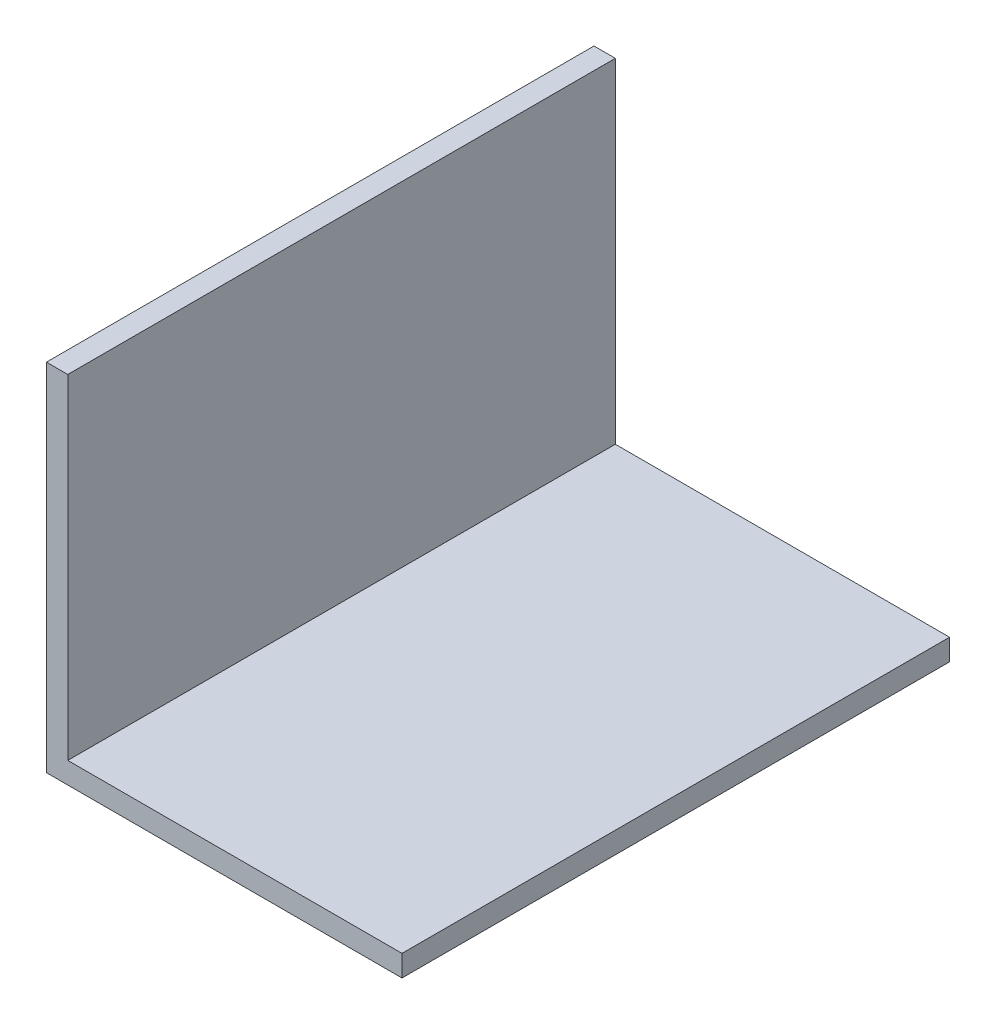
ISO-10303-21;
HEADER;
FILE_DESCRIPTION(('STEP AP214'),'2;1');
FILE_NAME('part.step','',(''),(''),'','','');
FILE_SCHEMA(('AUTOMOTIVE_DESIGN { 1 0 10303 214 1 1 1 1 }'));
ENDSEC;
DATA;
#1=APPLICATION_CONTEXT('core data for automotive mechanical design processes');
#2=APPLICATION_PROTOCOL_DEFINITION('international standard','automotive_design',2000,#1);
#3=PRODUCT_CONTEXT('',#1,'mechanical');
#4=PRODUCT('Part','Part','',(#3));
#5=PRODUCT_RELATED_PRODUCT_CATEGORY('part','',(#4));
#6=PRODUCT_DEFINITION_FORMATION('','',#4);
#7=PRODUCT_DEFINITION_CONTEXT('part definition',#1,'design');
#8=PRODUCT_DEFINITION('design','',#6,#7);
#9=PRODUCT_DEFINITION_SHAPE('','',#8);
#10=(LENGTH_UNIT() NAMED_UNIT(*) SI_UNIT(.MILLI.,.METRE.));
#11=(NAMED_UNIT(*) PLANE_ANGLE_UNIT() SI_UNIT($,.RADIAN.));
#12=(NAMED_UNIT(*) SI_UNIT($,.STERADIAN.) SOLID_ANGLE_UNIT());
#13=UNCERTAINTY_MEASURE_WITH_UNIT(LENGTH_MEASURE(1.E-05),#10,'distance_accuracy_value','');
#14=(GEOMETRIC_REPRESENTATION_CONTEXT(3) GLOBAL_UNCERTAINTY_ASSIGNED_CONTEXT((#13)) GLOBAL_UNIT_ASSIGNED_CONTEXT((#10,
#11,#12)) REPRESENTATION_CONTEXT('',''));
#15=CARTESIAN_POINT('',(0.,0.,0.));
#16=DIRECTION('',(0.,0.,1.));
#17=DIRECTION('',(1.,0.,0.));
#18=AXIS2_PLACEMENT_3D('',#15,#16,#17);
#19=CARTESIAN_POINT('',(25.,0.,38.5));
#20=DIRECTION('',(0.,1.,0.));
#21=DIRECTION('',(-1.,0.,0.));
#22=AXIS2_PLACEMENT_3D('',#19,#20,#21);
#23=PLANE('',#22);
#24=DIRECTION('',(1.,0.,0.));
#25=VECTOR('',#24,1.);
#26=CARTESIAN_POINT('',(25.,0.,0.));
#27=LINE('',#26,#25);
#28=CARTESIAN_POINT('',(0.,0.,0.));
#29=VERTEX_POINT('',#28);
#30=CARTESIAN_POINT('',(25.,0.,0.));
#31=VERTEX_POINT('',#30);
#32=EDGE_CURVE('E116',#29,#31,#27,.T.);
#33=ORIENTED_EDGE('',*,*,#32,.T.);
#34=DIRECTION('',(0.,0.,-1.));
#35=VECTOR('',#34,1.);
#36=CARTESIAN_POINT('',(25.,0.,38.5));
#37=LINE('',#36,#35);
#38=CARTESIAN_POINT('',(25.,0.,38.5));
#39=VERTEX_POINT('',#38);
#40=EDGE_CURVE('E11',#39,#31,#37,.T.);
#41=ORIENTED_EDGE('',*,*,#40,.F.);
#42=DIRECTION('',(1.,0.,0.));
#43=VECTOR('',#42,1.);
#44=CARTESIAN_POINT('',(25.,0.,38.5));
#45=LINE('',#44,#43);
#46=CARTESIAN_POINT('',(0.,0.,38.5));
#47=VERTEX_POINT('',#46);
#48=EDGE_CURVE('E126',#47,#39,#45,.T.);
#49=ORIENTED_EDGE('',*,*,#48,.F.);
#50=DIRECTION('',(0.,0.,-1.));
#51=VECTOR('',#50,1.);
#52=CARTESIAN_POINT('',(0.,0.,38.5));
#53=LINE('',#52,#51);
#54=EDGE_CURVE('E112',#47,#29,#53,.T.);
#55=ORIENTED_EDGE('',*,*,#54,.T.);
#56=EDGE_LOOP('',(#33,#41,#49,#55));
#57=FACE_BOUND('',#56,.T.);
#58=ADVANCED_FACE('F32',(#57),#23,.F.);
#59=CARTESIAN_POINT('',(25.,1.5,38.5));
#60=DIRECTION('',(-1.,0.,0.));
#61=DIRECTION('',(0.,0.,1.));
#62=AXIS2_PLACEMENT_3D('',#59,#60,#61);
#63=PLANE('',#62);
#64=DIRECTION('',(0.,1.,0.));
#65=VECTOR('',#64,1.);
#66=CARTESIAN_POINT('',(25.,1.5,0.));
#67=LINE('',#66,#65);
#68=CARTESIAN_POINT('',(25.,1.5,0.));
#69=VERTEX_POINT('',#68);
#70=EDGE_CURVE('E119',#31,#69,#67,.T.);
#71=ORIENTED_EDGE('',*,*,#70,.T.);
#72=DIRECTION('',(0.,0.,-1.));
#73=VECTOR('',#72,1.);
#74=CARTESIAN_POINT('',(25.,1.5,38.5));
#75=LINE('',#74,#73);
#76=CARTESIAN_POINT('',(25.,1.5,38.5));
#77=VERTEX_POINT('',#76);
#78=EDGE_CURVE('E40',#77,#69,#75,.T.);
#79=ORIENTED_EDGE('',*,*,#78,.F.);
#80=DIRECTION('',(0.,1.,0.));
#81=VECTOR('',#80,1.);
#82=CARTESIAN_POINT('',(25.,1.5,38.5));
#83=LINE('',#82,#81);
#84=EDGE_CURVE('E85',#39,#77,#83,.T.);
#85=ORIENTED_EDGE('',*,*,#84,.F.);
#86=ORIENTED_EDGE('',*,*,#40,.T.);
#87=EDGE_LOOP('',(#71,#79,#85,#86));
#88=FACE_BOUND('',#87,.T.);
#89=ADVANCED_FACE('F150',(#88),#63,.F.);
#90=CARTESIAN_POINT('',(1.5,1.5,38.5));
#91=DIRECTION('',(0.,-1.,0.));
#92=DIRECTION('',(0.,0.,-1.));
#93=AXIS2_PLACEMENT_3D('',#90,#91,#92);
#94=PLANE('',#93);
#95=DIRECTION('',(-1.,0.,0.));
#96=VECTOR('',#95,1.);
#97=CARTESIAN_POINT('',(1.5,1.5,0.));
#98=LINE('',#97,#96);
#99=CARTESIAN_POINT('',(1.5,1.5,0.));
#100=VERTEX_POINT('',#99);
#101=EDGE_CURVE('E121',#69,#100,#98,.T.);
#102=ORIENTED_EDGE('',*,*,#101,.T.);
#103=DIRECTION('',(0.,0.,-1.));
#104=VECTOR('',#103,1.);
#105=CARTESIAN_POINT('',(1.5,1.5,38.5));
#106=LINE('',#105,#104);
#107=CARTESIAN_POINT('',(1.5,1.5,38.5));
#108=VERTEX_POINT('',#107);
#109=EDGE_CURVE('E107',#108,#100,#106,.T.);
#110=ORIENTED_EDGE('',*,*,#109,.F.);
#111=DIRECTION('',(-1.,0.,0.));
#112=VECTOR('',#111,1.);
#113=CARTESIAN_POINT('',(1.5,1.5,38.5));
#114=LINE('',#113,#112);
#115=EDGE_CURVE('E98',#77,#108,#114,.T.);
#116=ORIENTED_EDGE('',*,*,#115,.F.);
#117=ORIENTED_EDGE('',*,*,#78,.T.);
#118=EDGE_LOOP('',(#102,#110,#116,#117));
#119=FACE_BOUND('',#118,.T.);
#120=ADVANCED_FACE('F132',(#119),#94,.F.);
#121=CARTESIAN_POINT('',(1.5,25.,38.5));
#122=DIRECTION('',(-1.,0.,0.));
#123=DIRECTION('',(0.,-1.,0.));
#124=AXIS2_PLACEMENT_3D('',#121,#122,#123);
#125=PLANE('',#124);
#126=DIRECTION('',(0.,1.,0.));
#127=VECTOR('',#126,1.);
#128=CARTESIAN_POINT('',(1.5,25.,0.));
#129=LINE('',#128,#127);
#130=CARTESIAN_POINT('',(1.5,25.,0.));
#131=VERTEX_POINT('',#130);
#132=EDGE_CURVE('E106',#100,#131,#129,.T.);
#133=ORIENTED_EDGE('',*,*,#132,.T.);
#134=DIRECTION('',(0.,0.,-1.));
#135=VECTOR('',#134,1.);
#136=CARTESIAN_POINT('',(1.5,25.,38.5));
#137=LINE('',#136,#135);
#138=CARTESIAN_POINT('',(1.5,25.,38.5));
#139=VERTEX_POINT('',#138);
#140=EDGE_CURVE('E103',#139,#131,#137,.T.);
#141=ORIENTED_EDGE('',*,*,#140,.F.);
#142=DIRECTION('',(0.,1.,0.));
#143=VECTOR('',#142,1.);
#144=CARTESIAN_POINT('',(1.5,25.,38.5));
#145=LINE('',#144,#143);
#146=EDGE_CURVE('E92',#108,#139,#145,.T.);
#147=ORIENTED_EDGE('',*,*,#146,.F.);
#148=ORIENTED_EDGE('',*,*,#109,.T.);
#149=EDGE_LOOP('',(#133,#141,#147,#148));
#150=FACE_BOUND('',#149,.T.);
#151=ADVANCED_FACE('F104',(#150),#125,.F.);
#152=CARTESIAN_POINT('',(0.,25.,38.5));
#153=DIRECTION('',(0.,-1.,0.));
#154=DIRECTION('',(0.,0.,-1.));
#155=AXIS2_PLACEMENT_3D('',#152,#153,#154);
#156=PLANE('',#155);
#157=DIRECTION('',(-1.,0.,0.));
#158=VECTOR('',#157,1.);
#159=CARTESIAN_POINT('',(0.,25.,0.));
#160=LINE('',#159,#158);
#161=CARTESIAN_POINT('',(0.,25.,0.));
#162=VERTEX_POINT('',#161);
#163=EDGE_CURVE('E71',#131,#162,#160,.T.);
#164=ORIENTED_EDGE('',*,*,#163,.T.);
#165=DIRECTION('',(0.,0.,-1.));
#166=VECTOR('',#165,1.);
#167=CARTESIAN_POINT('',(0.,25.,38.5));
#168=LINE('',#167,#166);
#169=CARTESIAN_POINT('',(0.,25.,38.5));
#170=VERTEX_POINT('',#169);
#171=EDGE_CURVE('E108',#170,#162,#168,.T.);
#172=ORIENTED_EDGE('',*,*,#171,.F.);
#173=DIRECTION('',(-1.,0.,0.));
#174=VECTOR('',#173,1.);
#175=CARTESIAN_POINT('',(0.,25.,38.5));
#176=LINE('',#175,#174);
#177=EDGE_CURVE('E96',#139,#170,#176,.T.);
#178=ORIENTED_EDGE('',*,*,#177,.F.);
#179=ORIENTED_EDGE('',*,*,#140,.T.);
#180=EDGE_LOOP('',(#164,#172,#178,#179));
#181=FACE_BOUND('',#180,.T.);
#182=ADVANCED_FACE('F110',(#181),#156,.F.);
#183=CARTESIAN_POINT('',(0.,0.,38.5));
#184=DIRECTION('',(1.,0.,0.));
#185=DIRECTION('',(0.,0.,-1.));
#186=AXIS2_PLACEMENT_3D('',#183,#184,#185);
#187=PLANE('',#186);
#188=DIRECTION('',(0.,-1.,0.));
#189=VECTOR('',#188,1.);
#190=CARTESIAN_POINT('',(0.,0.,0.));
#191=LINE('',#190,#189);
#192=EDGE_CURVE('E77',#162,#29,#191,.T.);
#193=ORIENTED_EDGE('',*,*,#192,.T.);
#194=ORIENTED_EDGE('',*,*,#54,.F.);
#195=DIRECTION('',(0.,-1.,0.));
#196=VECTOR('',#195,1.);
#197=CARTESIAN_POINT('',(0.,0.,38.5));
#198=LINE('',#197,#196);
#199=EDGE_CURVE('E48',#170,#47,#198,.T.);
#200=ORIENTED_EDGE('',*,*,#199,.F.);
#201=ORIENTED_EDGE('',*,*,#171,.T.);
#202=EDGE_LOOP('',(#193,#194,#200,#201));
#203=FACE_BOUND('',#202,.T.);
#204=ADVANCED_FACE('F139',(#203),#187,.F.);
#205=CARTESIAN_POINT('',(0.,0.,38.5));
#206=DIRECTION('',(0.,0.,-1.));
#207=DIRECTION('',(-1.,0.,0.));
#208=AXIS2_PLACEMENT_3D('',#205,#206,#207);
#209=PLANE('',#208);
#210=ORIENTED_EDGE('',*,*,#48,.T.);
#211=ORIENTED_EDGE('',*,*,#84,.T.);
#212=ORIENTED_EDGE('',*,*,#115,.T.);
#213=ORIENTED_EDGE('',*,*,#146,.T.);
#214=ORIENTED_EDGE('',*,*,#177,.T.);
#215=ORIENTED_EDGE('',*,*,#199,.T.);
#216=EDGE_LOOP('',(#210,#211,#212,#213,#214,#215));
#217=FACE_BOUND('',#216,.T.);
#218=ADVANCED_FACE('F94',(#217),#209,.F.);
#219=CARTESIAN_POINT('',(0.,0.,0.));
#220=DIRECTION('',(0.,0.,-1.));
#221=DIRECTION('',(-1.,0.,0.));
#222=AXIS2_PLACEMENT_3D('',#219,#220,#221);
#223=PLANE('',#222);
#224=ORIENTED_EDGE('',*,*,#32,.F.);
#225=ORIENTED_EDGE('',*,*,#192,.F.);
#226=ORIENTED_EDGE('',*,*,#163,.F.);
#227=ORIENTED_EDGE('',*,*,#132,.F.);
#228=ORIENTED_EDGE('',*,*,#101,.F.);
#229=ORIENTED_EDGE('',*,*,#70,.F.);
#230=EDGE_LOOP('',(#224,#225,#226,#227,#228,#229));
#231=FACE_BOUND('',#230,.T.);
#232=ADVANCED_FACE('F135',(#231),#223,.T.);
#233=CLOSED_SHELL('',(#58,#89,#120,#151,#182,#204,#218,#232));
#234=MANIFOLD_SOLID_BREP('B2',#233);
#235=ADVANCED_BREP_SHAPE_REPRESENTATION('',(#18,#234),#14);
#236=SHAPE_DEFINITION_REPRESENTATION(#9,#235);
ENDSEC;
END-ISO-10303-21;
